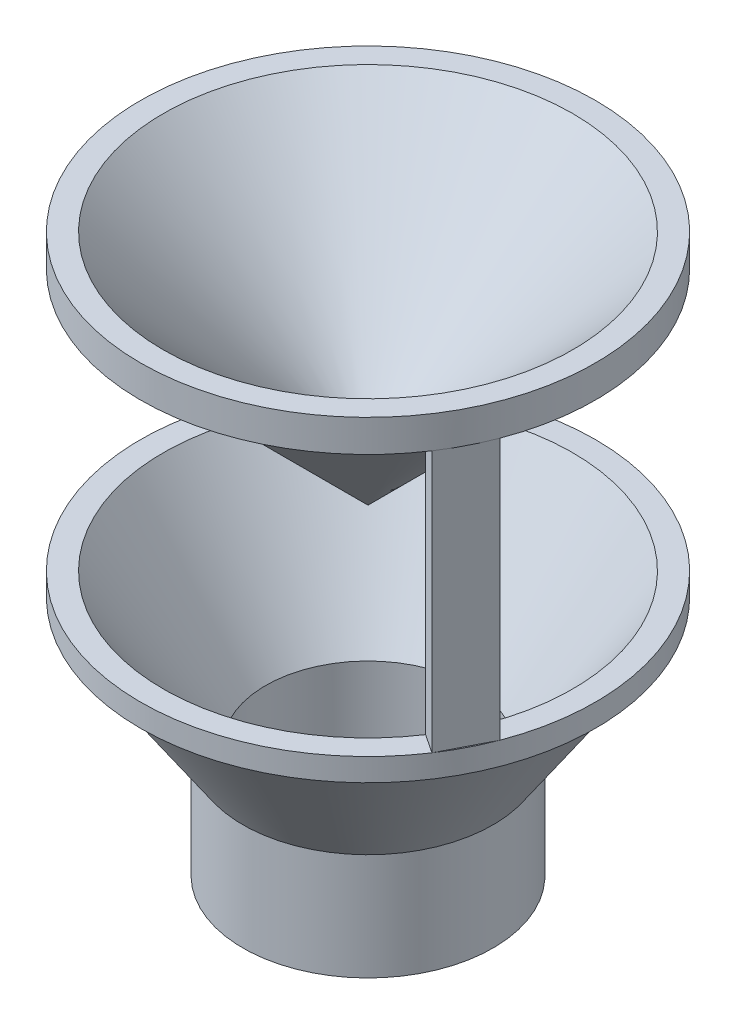
ISO-10303-21;
HEADER;
FILE_DESCRIPTION(('STEP AP214'),'2;1');
FILE_NAME('part.step','',(''),(''),'','','');
FILE_SCHEMA(('AUTOMOTIVE_DESIGN { 1 0 10303 214 1 1 1 1 }'));
ENDSEC;
DATA;
#1=APPLICATION_CONTEXT('core data for automotive mechanical design processes');
#2=APPLICATION_PROTOCOL_DEFINITION('international standard','automotive_design',2000,#1);
#3=PRODUCT_CONTEXT('',#1,'mechanical');
#4=PRODUCT('Part','Part','',(#3));
#5=PRODUCT_RELATED_PRODUCT_CATEGORY('part','',(#4));
#6=PRODUCT_DEFINITION_FORMATION('','',#4);
#7=PRODUCT_DEFINITION_CONTEXT('part definition',#1,'design');
#8=PRODUCT_DEFINITION('design','',#6,#7);
#9=PRODUCT_DEFINITION_SHAPE('','',#8);
#10=(LENGTH_UNIT() NAMED_UNIT(*) SI_UNIT(.MILLI.,.METRE.));
#11=(NAMED_UNIT(*) PLANE_ANGLE_UNIT() SI_UNIT($,.RADIAN.));
#12=(NAMED_UNIT(*) SI_UNIT($,.STERADIAN.) SOLID_ANGLE_UNIT());
#13=UNCERTAINTY_MEASURE_WITH_UNIT(LENGTH_MEASURE(1.E-05),#10,'distance_accuracy_value','');
#14=(GEOMETRIC_REPRESENTATION_CONTEXT(3) GLOBAL_UNCERTAINTY_ASSIGNED_CONTEXT((#13)) GLOBAL_UNIT_ASSIGNED_CONTEXT((#10,
#11,#12)) REPRESENTATION_CONTEXT('',''));
#15=CARTESIAN_POINT('',(0.,0.,0.));
#16=DIRECTION('',(0.,0.,1.));
#17=DIRECTION('',(1.,0.,0.));
#18=AXIS2_PLACEMENT_3D('',#15,#16,#17);
#19=CARTESIAN_POINT('',(-18.,13.2287565553229,0.));
#20=DIRECTION('',(0.,-1.,0.));
#21=DIRECTION('',(0.,0.,-1.));
#22=AXIS2_PLACEMENT_3D('',#19,#20,#21);
#23=PLANE('',#22);
#24=DIRECTION('',(0.934899032600559,0.,0.354913790719013));
#25=VECTOR('',#24,1.);
#26=CARTESIAN_POINT('',(16.8281825868101,13.228756555323,6.38844823294224));
#27=LINE('',#26,#25);
#28=CARTESIAN_POINT('',(16.8281825868101,13.228756555323,6.38844823294224));
#29=VERTEX_POINT('',#28);
#30=CARTESIAN_POINT('',(18.6979806520112,13.2287565553229,7.09827581438027));
#31=VERTEX_POINT('',#30);
#32=EDGE_CURVE('E166',#29,#31,#27,.T.);
#33=ORIENTED_EDGE('',*,*,#32,.T.);
#34=CARTESIAN_POINT('',(0.,13.2287565553229,0.));
#35=DIRECTION('',(0.,-1.,0.));
#36=DIRECTION('',(0.,0.,-1.));
#37=AXIS2_PLACEMENT_3D('',#34,#35,#36);
#38=CIRCLE('',#37,20.);
#39=CARTESIAN_POINT('',(-16.6843308410737,13.228756555323,-11.0287399273715));
#40=VERTEX_POINT('',#39);
#41=EDGE_CURVE('E381',#40,#31,#38,.T.);
#42=ORIENTED_EDGE('',*,*,#41,.F.);
#43=DIRECTION('',(0.834216542053683,0.,0.551436996368575));
#44=VECTOR('',#43,1.);
#45=CARTESIAN_POINT('',(-15.0158977569663,13.228756555323,-9.92586593463436));
#46=LINE('',#45,#44);
#47=CARTESIAN_POINT('',(-15.0158977569663,13.228756555323,-9.92586593463436));
#48=VERTEX_POINT('',#47);
#49=EDGE_CURVE('E423',#40,#48,#46,.T.);
#50=ORIENTED_EDGE('',*,*,#49,.T.);
#51=CARTESIAN_POINT('',(0.,13.228756555323,0.));
#52=DIRECTION('',(0.,-1.,0.));
#53=DIRECTION('',(0.,0.,-1.));
#54=AXIS2_PLACEMENT_3D('',#51,#52,#53);
#55=CIRCLE('',#54,18.);
#56=EDGE_CURVE('E405',#48,#29,#55,.T.);
#57=ORIENTED_EDGE('',*,*,#56,.T.);
#58=EDGE_LOOP('',(#33,#42,#50,#57));
#59=FACE_BOUND('',#58,.T.);
#60=ADVANCED_FACE('F39',(#59),#23,.F.);
#61=DIRECTION('',(-0.456440206209169,0.,0.889754088586128));
#62=VECTOR('',#61,1.);
#63=CARTESIAN_POINT('',(18.6979806520112,13.228756555323,7.09827581438027));
#64=LINE('',#63,#62);
#65=CARTESIAN_POINT('',(16.6724905238818,13.2287565553229,11.0466311485027));
#66=VERTEX_POINT('',#65);
#67=EDGE_CURVE('E171',#31,#66,#64,.T.);
#68=ORIENTED_EDGE('',*,*,#67,.T.);
#69=EDGE_CURVE('E449',#31,#66,#38,.T.);
#70=ORIENTED_EDGE('',*,*,#69,.F.);
#71=EDGE_LOOP('',(#68,#70));
#72=FACE_BOUND('',#71,.T.);
#73=ADVANCED_FACE('F294',(#72),#23,.F.);
#74=DIRECTION('',(-0.833624526194091,0.,-0.552331557425138));
#75=VECTOR('',#74,1.);
#76=CARTESIAN_POINT('',(15.0052414714936,13.228756555323,9.94196803365246));
#77=LINE('',#76,#75);
#78=CARTESIAN_POINT('',(15.0052414714934,13.228756555323,9.94196803365279));
#79=VERTEX_POINT('',#78);
#80=EDGE_CURVE('E61',#66,#79,#77,.T.);
#81=ORIENTED_EDGE('',*,*,#80,.T.);
#82=CARTESIAN_POINT('',(-16.8989833192235,13.228756555323,-6.19873880532221));
#83=VERTEX_POINT('',#82);
#84=EDGE_CURVE('E133',#79,#83,#55,.T.);
#85=ORIENTED_EDGE('',*,*,#84,.T.);
#86=DIRECTION('',(-0.938832406623525,0.,-0.344374378073456));
#87=VECTOR('',#86,1.);
#88=CARTESIAN_POINT('',(-16.8989833192235,13.228756555323,-6.19873880532221));
#89=LINE('',#88,#87);
#90=CARTESIAN_POINT('',(-18.7766481324705,13.228756555323,-6.88748756146912));
#91=VERTEX_POINT('',#90);
#92=EDGE_CURVE('E433',#83,#91,#89,.T.);
#93=ORIENTED_EDGE('',*,*,#92,.T.);
#94=EDGE_CURVE('E375',#66,#91,#38,.T.);
#95=ORIENTED_EDGE('',*,*,#94,.F.);
#96=EDGE_LOOP('',(#81,#85,#93,#95));
#97=FACE_BOUND('',#96,.T.);
#98=ADVANCED_FACE('F299',(#97),#23,.F.);
#99=CARTESIAN_POINT('',(18.,36.228756555323,0.));
#100=DIRECTION('',(0.,-1.,0.));
#101=DIRECTION('',(0.,0.,-1.));
#102=AXIS2_PLACEMENT_3D('',#99,#100,#101);
#103=PLANE('',#102);
#104=CARTESIAN_POINT('',(0.,36.228756555323,0.));
#105=DIRECTION('',(0.,-1.,0.));
#106=DIRECTION('',(0.,0.,-1.));
#107=AXIS2_PLACEMENT_3D('',#104,#105,#106);
#108=CIRCLE('',#107,20.);
#109=CARTESIAN_POINT('',(-16.6843308410737,36.228756555323,-11.0287399273715));
#110=VERTEX_POINT('',#109);
#111=CARTESIAN_POINT('',(18.6979806520112,36.228756555323,7.09827581438027));
#112=VERTEX_POINT('',#111);
#113=EDGE_CURVE('E211',#110,#112,#108,.T.);
#114=ORIENTED_EDGE('',*,*,#113,.T.);
#115=DIRECTION('',(0.934899032600559,0.,0.354913790719013));
#116=VECTOR('',#115,1.);
#117=CARTESIAN_POINT('',(16.8281825868101,36.228756555323,6.38844823294224));
#118=LINE('',#117,#116);
#119=CARTESIAN_POINT('',(16.8281825868101,36.228756555323,6.38844823294224));
#120=VERTEX_POINT('',#119);
#121=EDGE_CURVE('E181',#120,#112,#118,.T.);
#122=ORIENTED_EDGE('',*,*,#121,.F.);
#123=CARTESIAN_POINT('',(0.,36.228756555323,0.));
#124=DIRECTION('',(0.,-1.,0.));
#125=DIRECTION('',(0.,0.,-1.));
#126=AXIS2_PLACEMENT_3D('',#123,#124,#125);
#127=CIRCLE('',#126,18.);
#128=CARTESIAN_POINT('',(-15.0158977569663,36.228756555323,-9.92586593463436));
#129=VERTEX_POINT('',#128);
#130=EDGE_CURVE('E212',#129,#120,#127,.T.);
#131=ORIENTED_EDGE('',*,*,#130,.F.);
#132=DIRECTION('',(0.834216542053683,0.,0.551436996368575));
#133=VECTOR('',#132,1.);
#134=CARTESIAN_POINT('',(-15.0158977569663,36.228756555323,-9.92586593463436));
#135=LINE('',#134,#133);
#136=EDGE_CURVE('E322',#110,#129,#135,.T.);
#137=ORIENTED_EDGE('',*,*,#136,.F.);
#138=EDGE_LOOP('',(#114,#122,#131,#137));
#139=FACE_BOUND('',#138,.T.);
#140=ADVANCED_FACE('F242',(#139),#103,.T.);
#141=CARTESIAN_POINT('',(16.6724905238818,36.228756555323,11.0466311485027));
#142=VERTEX_POINT('',#141);
#143=EDGE_CURVE('E326',#112,#142,#108,.T.);
#144=ORIENTED_EDGE('',*,*,#143,.T.);
#145=DIRECTION('',(-0.456440206209169,0.,0.889754088586128));
#146=VECTOR('',#145,1.);
#147=CARTESIAN_POINT('',(18.6979806520112,36.228756555323,7.09827581438027));
#148=LINE('',#147,#146);
#149=EDGE_CURVE('E174',#112,#142,#148,.T.);
#150=ORIENTED_EDGE('',*,*,#149,.F.);
#151=EDGE_LOOP('',(#144,#150));
#152=FACE_BOUND('',#151,.T.);
#153=ADVANCED_FACE('F312',(#152),#103,.T.);
#154=CARTESIAN_POINT('',(15.0052414714936,36.228756555323,9.94196803365246));
#155=VERTEX_POINT('',#154);
#156=CARTESIAN_POINT('',(-16.8989833192233,36.228756555323,-6.19873880532257));
#157=VERTEX_POINT('',#156);
#158=EDGE_CURVE('E210',#155,#157,#127,.T.);
#159=ORIENTED_EDGE('',*,*,#158,.F.);
#160=DIRECTION('',(-0.833624526194091,0.,-0.552331557425138));
#161=VECTOR('',#160,1.);
#162=CARTESIAN_POINT('',(15.0052414714936,36.228756555323,9.94196803365246));
#163=LINE('',#162,#161);
#164=EDGE_CURVE('E167',#142,#155,#163,.T.);
#165=ORIENTED_EDGE('',*,*,#164,.F.);
#166=CARTESIAN_POINT('',(-18.7766481324705,36.228756555323,-6.88748756146912));
#167=VERTEX_POINT('',#166);
#168=EDGE_CURVE('E205',#142,#167,#108,.T.);
#169=ORIENTED_EDGE('',*,*,#168,.T.);
#170=DIRECTION('',(-0.938832406623525,0.,-0.344374378073456));
#171=VECTOR('',#170,1.);
#172=CARTESIAN_POINT('',(-16.8989833192235,36.228756555323,-6.19873880532221));
#173=LINE('',#172,#171);
#174=EDGE_CURVE('E338',#157,#167,#173,.T.);
#175=ORIENTED_EDGE('',*,*,#174,.F.);
#176=EDGE_LOOP('',(#159,#165,#169,#175));
#177=FACE_BOUND('',#176,.T.);
#178=ADVANCED_FACE('F240',(#177),#103,.T.);
#179=CARTESIAN_POINT('',(0.,18.2287565553229,0.));
#180=DIRECTION('',(0.,1.,0.));
#181=DIRECTION('',(0.,0.,1.));
#182=AXIS2_PLACEMENT_3D('',#179,#180,#181);
#183=CONICAL_SURFACE('',#182,0.,0.785398163397447);
#184=CARTESIAN_POINT('',(0.,18.2287565553229,0.));
#185=VERTEX_POINT('',#184);
#186=VERTEX_LOOP('',#185);
#187=FACE_BOUND('',#186,.T.);
#188=ORIENTED_EDGE('',*,*,#130,.T.);
#189=CARTESIAN_POINT('',(16.82827151922,36.2287687167156,6.38824823294224));
#190=CARTESIAN_POINT('',(16.6928070430401,36.2102277795282,6.69289414607938));
#191=CARTESIAN_POINT('',(16.5573425668601,36.2009573109344,6.99754005921651));
#192=CARTESIAN_POINT('',(16.2864136145002,36.2009573109344,7.60683188549077));
#193=CARTESIAN_POINT('',(16.1509491383203,36.2102277795282,7.9114777986279));
#194=CARTESIAN_POINT('',(16.0154846621404,36.2287687167156,8.21612371176504));
#195=B_SPLINE_CURVE_WITH_KNOTS('',3,(#189,#190,#191,#192,#193,#194),.UNSPECIFIED.,.F.,.F.,(4,2,
4),(0.,1.00060545899585,2.00121091799169),.UNSPECIFIED.);
#196=CARTESIAN_POINT('',(16.0155735945503,36.228756555323,8.21592371176504));
#197=VERTEX_POINT('',#196);
#198=EDGE_CURVE('E11',#120,#197,#195,.T.);
#199=ORIENTED_EDGE('',*,*,#198,.T.);
#200=CARTESIAN_POINT('',(16.0156906636325,36.2287694314635,8.21572371176504));
#201=CARTESIAN_POINT('',(15.847262953429,36.2102280177775,8.50346443207961));
#202=CARTESIAN_POINT('',(15.6788352432255,36.2009573109344,8.79120515239418));
#203=CARTESIAN_POINT('',(15.3419798228185,36.2009573109344,9.36668659302332));
#204=CARTESIAN_POINT('',(15.1735521126149,36.2102280177775,9.65442731333789));
#205=CARTESIAN_POINT('',(15.0051244024114,36.2287694314635,9.94216803365246));
#206=B_SPLINE_CURVE_WITH_KNOTS('',3,(#200,#201,#202,#203,#204,#205),.UNSPECIFIED.,.F.,.F.,(4,2,
4),(0.,1.00061833646613,2.00123667293226),.UNSPECIFIED.);
#207=EDGE_CURVE('E54',#197,#155,#206,.T.);
#208=ORIENTED_EDGE('',*,*,#207,.T.);
#209=ORIENTED_EDGE('',*,*,#158,.T.);
#210=CARTESIAN_POINT('',(-16.0242902809367,36.2287697925721,-8.19893880532221));
#211=CARTESIAN_POINT('',(-16.1700870307441,36.2066807699022,-7.86553880532221));
#212=CARTESIAN_POINT('',(-16.3158837805516,36.1956362585673,-7.53213880532221));
#213=CARTESIAN_POINT('',(-16.6074772801664,36.1956362585673,-6.86533880532221));
#214=CARTESIAN_POINT('',(-16.7532740299738,36.2066807699022,-6.53193880532221));
#215=CARTESIAN_POINT('',(-16.8990707797812,36.2287697925721,-6.19853880532221));
#216=B_SPLINE_CURVE_WITH_KNOTS('',3,(#210,#211,#212,#213,#214,#215),.UNSPECIFIED.,.F.,.F.,(4,2,
4),(0.,1.09215754420565,2.18431508841129),.UNSPECIFIED.);
#217=CARTESIAN_POINT('',(-16.0243777414943,36.228756555323,-8.19873880532256));
#218=VERTEX_POINT('',#217);
#219=EDGE_CURVE('E216',#218,#157,#216,.T.);
#220=ORIENTED_EDGE('',*,*,#219,.F.);
#221=CARTESIAN_POINT('',(-15.0157809757558,36.22876942339,-9.92606593463436));
#222=CARTESIAN_POINT('',(-15.1838999002473,36.2102280150863,-9.63814474641566));
#223=CARTESIAN_POINT('',(-15.3520188247388,36.2009573109344,-9.35022355819697));
#224=CARTESIAN_POINT('',(-15.6882566737219,36.2009573109344,-8.77438118175959));
#225=CARTESIAN_POINT('',(-15.8563755982135,36.2102280150863,-8.4864599935409));
#226=CARTESIAN_POINT('',(-16.024494522705,36.22876942339,-8.1985388053222));
#227=B_SPLINE_CURVE_WITH_KNOTS('',3,(#221,#222,#223,#224,#225,#226),.UNSPECIFIED.,.F.,.F.,(4,2,
4),(0.,1.00061819100811,2.00123638201623),.UNSPECIFIED.);
#228=EDGE_CURVE('E225',#129,#218,#227,.T.);
#229=ORIENTED_EDGE('',*,*,#228,.F.);
#230=EDGE_LOOP('',(#188,#199,#208,#209,#220,#229));
#231=FACE_BOUND('',#230,.T.);
#232=ADVANCED_FACE('F235',(#187,#231),#183,.T.);
#233=EDGE_CURVE('E376',#91,#40,#38,.T.);
#234=ORIENTED_EDGE('',*,*,#233,.F.);
#235=DIRECTION('',(0.45094969167841,0.,-0.892549368704693));
#236=VECTOR('',#235,1.);
#237=CARTESIAN_POINT('',(-16.6843308410737,13.228756555323,-11.0287399273715));
#238=LINE('',#237,#236);
#239=EDGE_CURVE('E359',#91,#40,#238,.T.);
#240=ORIENTED_EDGE('',*,*,#239,.T.);
#241=EDGE_LOOP('',(#234,#240));
#242=FACE_BOUND('',#241,.T.);
#243=ADVANCED_FACE('F41',(#242),#23,.F.);
#244=CARTESIAN_POINT('',(0.,0.,0.));
#245=DIRECTION('',(0.,1.,0.));
#246=DIRECTION('',(0.,0.,1.));
#247=AXIS2_PLACEMENT_3D('',#244,#245,#246);
#248=CONICAL_SURFACE('',#247,9.,0.59740641664535);
#249=CARTESIAN_POINT('',(-16.0243777414945,13.228756555323,-8.19873880532221));
#250=VERTEX_POINT('',#249);
#251=EDGE_CURVE('E256',#83,#250,#55,.T.);
#252=ORIENTED_EDGE('',*,*,#251,.F.);
#253=ORIENTED_EDGE('',*,*,#84,.F.);
#254=CARTESIAN_POINT('',(0.,13.228756555323,0.));
#255=DIRECTION('',(0.,-1.,0.));
#256=DIRECTION('',(0.,0.,-1.));
#257=AXIS2_PLACEMENT_3D('',#254,#255,#256);
#258=CIRCLE('',#257,18.);
#259=CARTESIAN_POINT('',(16.0155735945503,13.228756555323,8.21592371176504));
#260=VERTEX_POINT('',#259);
#261=EDGE_CURVE('E129',#79,#260,#258,.F.);
#262=ORIENTED_EDGE('',*,*,#261,.T.);
#263=EDGE_CURVE('E69',#260,#29,#258,.F.);
#264=ORIENTED_EDGE('',*,*,#263,.T.);
#265=ORIENTED_EDGE('',*,*,#56,.F.);
#266=EDGE_CURVE('E408',#250,#48,#55,.T.);
#267=ORIENTED_EDGE('',*,*,#266,.F.);
#268=EDGE_LOOP('',(#252,#253,#262,#264,#265,#267));
#269=FACE_BOUND('',#268,.T.);
#270=CARTESIAN_POINT('',(0.,0.,0.));
#271=DIRECTION('',(0.,-1.,0.));
#272=DIRECTION('',(0.,0.,-1.));
#273=AXIS2_PLACEMENT_3D('',#270,#271,#272);
#274=CIRCLE('',#273,9.);
#275=CARTESIAN_POINT('',(0.,0.,-9.));
#276=VERTEX_POINT('',#275);
#277=EDGE_CURVE('E400',#276,#276,#274,.T.);
#278=ORIENTED_EDGE('',*,*,#277,.T.);
#279=EDGE_LOOP('',(#278));
#280=FACE_BOUND('',#279,.T.);
#281=ADVANCED_FACE('F131',(#269,#280),#248,.F.);
#282=CARTESIAN_POINT('',(0.,0.,0.));
#283=DIRECTION('',(0.,-1.,0.));
#284=DIRECTION('',(0.,0.,-1.));
#285=AXIS2_PLACEMENT_3D('',#282,#283,#284);
#286=CYLINDRICAL_SURFACE('',#285,9.);
#287=ORIENTED_EDGE('',*,*,#277,.F.);
#288=EDGE_LOOP('',(#287));
#289=FACE_BOUND('',#288,.T.);
#290=CARTESIAN_POINT('',(0.,-10.,0.));
#291=DIRECTION('',(0.,-1.,0.));
#292=DIRECTION('',(0.,0.,-1.));
#293=AXIS2_PLACEMENT_3D('',#290,#291,#292);
#294=CIRCLE('',#293,9.);
#295=CARTESIAN_POINT('',(0.,-10.,-9.));
#296=VERTEX_POINT('',#295);
#297=EDGE_CURVE('E397',#296,#296,#294,.T.);
#298=ORIENTED_EDGE('',*,*,#297,.T.);
#299=EDGE_LOOP('',(#298));
#300=FACE_BOUND('',#299,.T.);
#301=ADVANCED_FACE('F306',(#289,#300),#286,.F.);
#302=CARTESIAN_POINT('',(-9.,-10.,0.));
#303=DIRECTION('',(0.,-1.,0.));
#304=DIRECTION('',(0.,0.,-1.));
#305=AXIS2_PLACEMENT_3D('',#302,#303,#304);
#306=PLANE('',#305);
#307=CARTESIAN_POINT('',(0.,-10.,0.));
#308=DIRECTION('',(0.,-1.,0.));
#309=DIRECTION('',(0.,0.,-1.));
#310=AXIS2_PLACEMENT_3D('',#307,#308,#309);
#311=CIRCLE('',#310,11.);
#312=CARTESIAN_POINT('',(0.,-10.,-11.));
#313=VERTEX_POINT('',#312);
#314=EDGE_CURVE('E393',#313,#313,#311,.T.);
#315=ORIENTED_EDGE('',*,*,#314,.T.);
#316=EDGE_LOOP('',(#315));
#317=FACE_BOUND('',#316,.T.);
#318=ORIENTED_EDGE('',*,*,#297,.F.);
#319=EDGE_LOOP('',(#318));
#320=FACE_BOUND('',#319,.T.);
#321=ADVANCED_FACE('F484',(#317,#320),#306,.T.);
#322=CARTESIAN_POINT('',(0.,0.,0.));
#323=DIRECTION('',(0.,-1.,0.));
#324=DIRECTION('',(0.,0.,-1.));
#325=AXIS2_PLACEMENT_3D('',#322,#323,#324);
#326=CYLINDRICAL_SURFACE('',#325,11.);
#327=CARTESIAN_POINT('',(0.,-0.615831876594899,0.));
#328=DIRECTION('',(0.,-1.,0.));
#329=DIRECTION('',(0.,0.,-1.));
#330=AXIS2_PLACEMENT_3D('',#327,#328,#329);
#331=CIRCLE('',#330,11.);
#332=CARTESIAN_POINT('',(0.,-0.615831876594899,-11.));
#333=VERTEX_POINT('',#332);
#334=EDGE_CURVE('E389',#333,#333,#331,.T.);
#335=ORIENTED_EDGE('',*,*,#334,.T.);
#336=EDGE_LOOP('',(#335));
#337=FACE_BOUND('',#336,.T.);
#338=ORIENTED_EDGE('',*,*,#314,.F.);
#339=EDGE_LOOP('',(#338));
#340=FACE_BOUND('',#339,.T.);
#341=ADVANCED_FACE('F480',(#337,#340),#326,.T.);
#342=CARTESIAN_POINT('',(0.,-0.615831876594899,0.));
#343=DIRECTION('',(0.,1.,0.));
#344=DIRECTION('',(0.,0.,1.));
#345=AXIS2_PLACEMENT_3D('',#342,#343,#344);
#346=CONICAL_SURFACE('',#345,11.,0.59740641664535);
#347=CARTESIAN_POINT('',(0.,11.2287565553229,0.));
#348=DIRECTION('',(0.,-1.,0.));
#349=DIRECTION('',(0.,0.,-1.));
#350=AXIS2_PLACEMENT_3D('',#347,#348,#349);
#351=CIRCLE('',#350,19.0583005244258);
#352=CARTESIAN_POINT('',(0.,11.2287565553229,-19.0583005244258));
#353=VERTEX_POINT('',#352);
#354=EDGE_CURVE('E385',#353,#353,#351,.T.);
#355=ORIENTED_EDGE('',*,*,#354,.T.);
#356=EDGE_LOOP('',(#355));
#357=FACE_BOUND('',#356,.T.);
#358=ORIENTED_EDGE('',*,*,#334,.F.);
#359=EDGE_LOOP('',(#358));
#360=FACE_BOUND('',#359,.T.);
#361=ADVANCED_FACE('F473',(#357,#360),#346,.T.);
#362=CARTESIAN_POINT('',(-18.,11.2287565553229,0.));
#363=DIRECTION('',(0.,-1.,0.));
#364=DIRECTION('',(0.,0.,-1.));
#365=AXIS2_PLACEMENT_3D('',#362,#363,#364);
#366=PLANE('',#365);
#367=CARTESIAN_POINT('',(0.,11.2287565553229,0.));
#368=DIRECTION('',(0.,-1.,0.));
#369=DIRECTION('',(0.,0.,-1.));
#370=AXIS2_PLACEMENT_3D('',#367,#368,#369);
#371=CIRCLE('',#370,20.);
#372=CARTESIAN_POINT('',(0.,11.2287565553229,-20.));
#373=VERTEX_POINT('',#372);
#374=EDGE_CURVE('E380',#373,#373,#371,.T.);
#375=ORIENTED_EDGE('',*,*,#374,.T.);
#376=EDGE_LOOP('',(#375));
#377=FACE_BOUND('',#376,.T.);
#378=ORIENTED_EDGE('',*,*,#354,.F.);
#379=EDGE_LOOP('',(#378));
#380=FACE_BOUND('',#379,.T.);
#381=ADVANCED_FACE('F468',(#377,#380),#366,.T.);
#382=CARTESIAN_POINT('',(0.,0.,0.));
#383=DIRECTION('',(0.,-1.,0.));
#384=DIRECTION('',(0.,0.,-1.));
#385=AXIS2_PLACEMENT_3D('',#382,#383,#384);
#386=CYLINDRICAL_SURFACE('',#385,20.);
#387=ORIENTED_EDGE('',*,*,#233,.T.);
#388=ORIENTED_EDGE('',*,*,#41,.T.);
#389=ORIENTED_EDGE('',*,*,#69,.T.);
#390=ORIENTED_EDGE('',*,*,#94,.T.);
#391=EDGE_LOOP('',(#387,#388,#389,#390));
#392=FACE_BOUND('',#391,.T.);
#393=ORIENTED_EDGE('',*,*,#374,.F.);
#394=EDGE_LOOP('',(#393));
#395=FACE_BOUND('',#394,.T.);
#396=ADVANCED_FACE('F445',(#392,#395),#386,.T.);
#397=CARTESIAN_POINT('',(0.,13.228756555323,0.));
#398=DIRECTION('',(0.,1.,0.));
#399=DIRECTION('',(0.,0.,1.));
#400=AXIS2_PLACEMENT_3D('',#397,#398,#399);
#401=PLANE('',#400);
#402=DIRECTION('',(-0.400667167823377,0.,0.916223673907411));
#403=VECTOR('',#402,1.);
#404=CARTESIAN_POINT('',(-16.0243777414945,13.228756555323,-8.19873880532221));
#405=LINE('',#404,#403);
#406=EDGE_CURVE('E439',#250,#83,#405,.T.);
#407=ORIENTED_EDGE('',*,*,#406,.T.);
#408=ORIENTED_EDGE('',*,*,#251,.T.);
#409=EDGE_LOOP('',(#407,#408));
#410=FACE_BOUND('',#409,.T.);
#411=ADVANCED_FACE('F244',(#410),#401,.F.);
#412=DIRECTION('',(-0.504239992264096,0.,0.863563564656073));
#413=VECTOR('',#412,1.);
#414=CARTESIAN_POINT('',(-16.0243777414945,13.228756555323,-8.19873880532221));
#415=LINE('',#414,#413);
#416=EDGE_CURVE('E419',#48,#250,#415,.T.);
#417=ORIENTED_EDGE('',*,*,#416,.T.);
#418=ORIENTED_EDGE('',*,*,#266,.T.);
#419=EDGE_LOOP('',(#417,#418));
#420=FACE_BOUND('',#419,.T.);
#421=ADVANCED_FACE('F418',(#420),#401,.F.);
#422=CARTESIAN_POINT('',(-16.0243777414945,13.228756555323,-8.19873880532221));
#423=DIRECTION('',(-0.863563564656074,0.,-0.504239992264096));
#424=DIRECTION('',(-0.504239992264096,0.,0.863563564656074));
#425=AXIS2_PLACEMENT_3D('',#422,#423,#424);
#426=PLANE('',#425);
#427=DIRECTION('',(0.,1.,0.));
#428=VECTOR('',#427,1.);
#429=CARTESIAN_POINT('',(-15.0158977569663,13.228756555323,-9.92586593463436));
#430=LINE('',#429,#428);
#431=EDGE_CURVE('E368',#48,#129,#430,.T.);
#432=ORIENTED_EDGE('',*,*,#431,.T.);
#433=ORIENTED_EDGE('',*,*,#228,.T.);
#434=DIRECTION('',(0.,1.,0.));
#435=VECTOR('',#434,1.);
#436=CARTESIAN_POINT('',(-16.0243777414945,13.228756555323,-8.19873880532221));
#437=LINE('',#436,#435);
#438=EDGE_CURVE('E366',#250,#218,#437,.T.);
#439=ORIENTED_EDGE('',*,*,#438,.F.);
#440=ORIENTED_EDGE('',*,*,#416,.F.);
#441=EDGE_LOOP('',(#432,#433,#439,#440));
#442=FACE_BOUND('',#441,.T.);
#443=ADVANCED_FACE('F461',(#442),#426,.F.);
#444=CARTESIAN_POINT('',(-16.0243777414945,13.228756555323,-8.19873880532221));
#445=DIRECTION('',(-0.916223673907411,0.,-0.400667167823377));
#446=DIRECTION('',(-0.400667167823377,0.,0.916223673907411));
#447=AXIS2_PLACEMENT_3D('',#444,#445,#446);
#448=PLANE('',#447);
#449=ORIENTED_EDGE('',*,*,#438,.T.);
#450=ORIENTED_EDGE('',*,*,#219,.T.);
#451=DIRECTION('',(0.,1.,0.));
#452=VECTOR('',#451,1.);
#453=CARTESIAN_POINT('',(-16.8989833192235,13.228756555323,-6.19873880532221));
#454=LINE('',#453,#452);
#455=EDGE_CURVE('E354',#83,#157,#454,.T.);
#456=ORIENTED_EDGE('',*,*,#455,.F.);
#457=ORIENTED_EDGE('',*,*,#406,.F.);
#458=EDGE_LOOP('',(#449,#450,#456,#457));
#459=FACE_BOUND('',#458,.T.);
#460=ADVANCED_FACE('F232',(#459),#448,.F.);
#461=CARTESIAN_POINT('',(-16.8989833192235,13.228756555323,-6.19873880532221));
#462=DIRECTION('',(0.344374378073456,0.,-0.938832406623525));
#463=DIRECTION('',(-0.938832406623525,0.,-0.344374378073456));
#464=AXIS2_PLACEMENT_3D('',#461,#462,#463);
#465=PLANE('',#464);
#466=ORIENTED_EDGE('',*,*,#174,.T.);
#467=DIRECTION('',(0.,1.,0.));
#468=VECTOR('',#467,1.);
#469=CARTESIAN_POINT('',(-18.7766481324705,13.228756555323,-6.88748756146912));
#470=LINE('',#469,#468);
#471=EDGE_CURVE('E351',#91,#167,#470,.T.);
#472=ORIENTED_EDGE('',*,*,#471,.F.);
#473=ORIENTED_EDGE('',*,*,#92,.F.);
#474=ORIENTED_EDGE('',*,*,#455,.T.);
#475=EDGE_LOOP('',(#466,#472,#473,#474));
#476=FACE_BOUND('',#475,.T.);
#477=ADVANCED_FACE('F349',(#476),#465,.F.);
#478=CARTESIAN_POINT('',(-16.6843308410737,13.228756555323,-11.0287399273715));
#479=DIRECTION('',(0.892549368704693,0.,0.45094969167841));
#480=DIRECTION('',(0.45094969167841,0.,-0.892549368704693));
#481=AXIS2_PLACEMENT_3D('',#478,#479,#480);
#482=PLANE('',#481);
#483=DIRECTION('',(0.45094969167841,0.,-0.892549368704693));
#484=VECTOR('',#483,1.);
#485=CARTESIAN_POINT('',(-16.6843308410737,36.228756555323,-11.0287399273715));
#486=LINE('',#485,#484);
#487=EDGE_CURVE('E340',#167,#110,#486,.T.);
#488=ORIENTED_EDGE('',*,*,#487,.T.);
#489=DIRECTION('',(0.,1.,0.));
#490=VECTOR('',#489,1.);
#491=CARTESIAN_POINT('',(-16.6843308410737,13.228756555323,-11.0287399273715));
#492=LINE('',#491,#490);
#493=EDGE_CURVE('E362',#40,#110,#492,.T.);
#494=ORIENTED_EDGE('',*,*,#493,.F.);
#495=ORIENTED_EDGE('',*,*,#239,.F.);
#496=ORIENTED_EDGE('',*,*,#471,.T.);
#497=EDGE_LOOP('',(#488,#494,#495,#496));
#498=FACE_BOUND('',#497,.T.);
#499=ADVANCED_FACE('F357',(#498),#482,.F.);
#500=CARTESIAN_POINT('',(-15.0158977569663,13.228756555323,-9.92586593463436));
#501=DIRECTION('',(-0.551436996368575,0.,0.834216542053683));
#502=DIRECTION('',(0.834216542053683,0.,0.551436996368575));
#503=AXIS2_PLACEMENT_3D('',#500,#501,#502);
#504=PLANE('',#503);
#505=ORIENTED_EDGE('',*,*,#136,.T.);
#506=ORIENTED_EDGE('',*,*,#431,.F.);
#507=ORIENTED_EDGE('',*,*,#49,.F.);
#508=ORIENTED_EDGE('',*,*,#493,.T.);
#509=EDGE_LOOP('',(#505,#506,#507,#508));
#510=FACE_BOUND('',#509,.T.);
#511=ADVANCED_FACE('F290',(#510),#504,.F.);
#512=ORIENTED_EDGE('',*,*,#487,.F.);
#513=EDGE_CURVE('E206',#167,#110,#108,.T.);
#514=ORIENTED_EDGE('',*,*,#513,.T.);
#515=EDGE_LOOP('',(#512,#514));
#516=FACE_BOUND('',#515,.T.);
#517=ADVANCED_FACE('F285',(#516),#103,.T.);
#518=CARTESIAN_POINT('',(0.,0.,0.));
#519=DIRECTION('',(0.,-1.,0.));
#520=DIRECTION('',(0.,0.,-1.));
#521=AXIS2_PLACEMENT_3D('',#518,#519,#520);
#522=CYLINDRICAL_SURFACE('',#521,20.);
#523=CARTESIAN_POINT('',(0.,39.0571836800691,0.));
#524=DIRECTION('',(0.,-1.,0.));
#525=DIRECTION('',(0.,0.,-1.));
#526=AXIS2_PLACEMENT_3D('',#523,#524,#525);
#527=CIRCLE('',#526,20.);
#528=CARTESIAN_POINT('',(0.,39.0571836800691,-20.));
#529=VERTEX_POINT('',#528);
#530=EDGE_CURVE('E201',#529,#529,#527,.T.);
#531=ORIENTED_EDGE('',*,*,#530,.T.);
#532=EDGE_LOOP('',(#531));
#533=FACE_BOUND('',#532,.T.);
#534=ORIENTED_EDGE('',*,*,#513,.F.);
#535=ORIENTED_EDGE('',*,*,#168,.F.);
#536=ORIENTED_EDGE('',*,*,#143,.F.);
#537=ORIENTED_EDGE('',*,*,#113,.F.);
#538=EDGE_LOOP('',(#534,#535,#536,#537));
#539=FACE_BOUND('',#538,.T.);
#540=ADVANCED_FACE('F282',(#533,#539),#522,.T.);
#541=CARTESIAN_POINT('',(20.,39.0571836800691,0.));
#542=DIRECTION('',(0.,1.,0.));
#543=DIRECTION('',(0.,0.,1.));
#544=AXIS2_PLACEMENT_3D('',#541,#542,#543);
#545=PLANE('',#544);
#546=CARTESIAN_POINT('',(0.,39.0571836800691,0.));
#547=DIRECTION('',(0.,-1.,0.));
#548=DIRECTION('',(0.,0.,-1.));
#549=AXIS2_PLACEMENT_3D('',#546,#547,#548);
#550=CIRCLE('',#549,18.);
#551=CARTESIAN_POINT('',(0.,39.0571836800691,-18.));
#552=VERTEX_POINT('',#551);
#553=EDGE_CURVE('E138',#552,#552,#550,.T.);
#554=ORIENTED_EDGE('',*,*,#553,.T.);
#555=EDGE_LOOP('',(#554));
#556=FACE_BOUND('',#555,.T.);
#557=ORIENTED_EDGE('',*,*,#530,.F.);
#558=EDGE_LOOP('',(#557));
#559=FACE_BOUND('',#558,.T.);
#560=ADVANCED_FACE('F279',(#556,#559),#545,.T.);
#561=CARTESIAN_POINT('',(0.,39.0571836800691,0.));
#562=DIRECTION('',(0.,1.,0.));
#563=DIRECTION('',(0.,0.,1.));
#564=AXIS2_PLACEMENT_3D('',#561,#562,#563);
#565=CONICAL_SURFACE('',#564,18.,0.785398163397448);
#566=CARTESIAN_POINT('',(0.,21.0571836800691,0.));
#567=VERTEX_POINT('',#566);
#568=VERTEX_LOOP('',#567);
#569=FACE_BOUND('',#568,.T.);
#570=ORIENTED_EDGE('',*,*,#553,.F.);
#571=EDGE_LOOP('',(#570));
#572=FACE_BOUND('',#571,.T.);
#573=ADVANCED_FACE('F276',(#569,#572),#565,.F.);
#574=CARTESIAN_POINT('',(0.,13.228756555323,0.));
#575=DIRECTION('',(0.,-1.,0.));
#576=DIRECTION('',(0.,0.,-1.));
#577=AXIS2_PLACEMENT_3D('',#574,#575,#576);
#578=PLANE('',#577);
#579=ORIENTED_EDGE('',*,*,#261,.F.);
#580=DIRECTION('',(0.505166061528334,0.,-0.86302216094371));
#581=VECTOR('',#580,1.);
#582=CARTESIAN_POINT('',(16.0155735945503,13.228756555323,8.21592371176504));
#583=LINE('',#582,#581);
#584=EDGE_CURVE('E149',#79,#260,#583,.T.);
#585=ORIENTED_EDGE('',*,*,#584,.T.);
#586=EDGE_LOOP('',(#579,#585));
#587=FACE_BOUND('',#586,.T.);
#588=ADVANCED_FACE('F151',(#587),#578,.T.);
#589=ORIENTED_EDGE('',*,*,#263,.F.);
#590=DIRECTION('',(0.406304496129873,0.,-0.913737739411397));
#591=VECTOR('',#590,1.);
#592=CARTESIAN_POINT('',(16.0155735945503,13.228756555323,8.21592371176504));
#593=LINE('',#592,#591);
#594=EDGE_CURVE('E144',#260,#29,#593,.T.);
#595=ORIENTED_EDGE('',*,*,#594,.T.);
#596=EDGE_LOOP('',(#589,#595));
#597=FACE_BOUND('',#596,.T.);
#598=ADVANCED_FACE('F142',(#597),#578,.T.);
#599=CARTESIAN_POINT('',(16.0155735945503,13.228756555323,8.21592371176504));
#600=DIRECTION('',(0.913737739411397,0.,0.406304496129873));
#601=DIRECTION('',(0.406304496129873,0.,-0.913737739411397));
#602=AXIS2_PLACEMENT_3D('',#599,#600,#601);
#603=PLANE('',#602);
#604=ORIENTED_EDGE('',*,*,#198,.F.);
#605=DIRECTION('',(0.,1.,0.));
#606=VECTOR('',#605,1.);
#607=CARTESIAN_POINT('',(16.8281825868101,13.228756555323,6.38844823294224));
#608=LINE('',#607,#606);
#609=EDGE_CURVE('E147',#29,#120,#608,.T.);
#610=ORIENTED_EDGE('',*,*,#609,.F.);
#611=ORIENTED_EDGE('',*,*,#594,.F.);
#612=DIRECTION('',(0.,1.,0.));
#613=VECTOR('',#612,1.);
#614=CARTESIAN_POINT('',(16.0155735945503,13.228756555323,8.21592371176504));
#615=LINE('',#614,#613);
#616=EDGE_CURVE('E154',#260,#197,#615,.T.);
#617=ORIENTED_EDGE('',*,*,#616,.T.);
#618=EDGE_LOOP('',(#604,#610,#611,#617));
#619=FACE_BOUND('',#618,.T.);
#620=ADVANCED_FACE('F163',(#619),#603,.F.);
#621=CARTESIAN_POINT('',(16.8281825868101,13.228756555323,6.38844823294224));
#622=DIRECTION('',(-0.354913790719013,0.,0.934899032600559));
#623=DIRECTION('',(0.934899032600559,0.,0.354913790719013));
#624=AXIS2_PLACEMENT_3D('',#621,#622,#623);
#625=PLANE('',#624);
#626=ORIENTED_EDGE('',*,*,#121,.T.);
#627=DIRECTION('',(0.,1.,0.));
#628=VECTOR('',#627,1.);
#629=CARTESIAN_POINT('',(18.6979806520112,13.228756555323,7.09827581438027));
#630=LINE('',#629,#628);
#631=EDGE_CURVE('E192',#31,#112,#630,.T.);
#632=ORIENTED_EDGE('',*,*,#631,.F.);
#633=ORIENTED_EDGE('',*,*,#32,.F.);
#634=ORIENTED_EDGE('',*,*,#609,.T.);
#635=EDGE_LOOP('',(#626,#632,#633,#634));
#636=FACE_BOUND('',#635,.T.);
#637=ADVANCED_FACE('F269',(#636),#625,.F.);
#638=CARTESIAN_POINT('',(18.6979806520112,13.228756555323,7.09827581438027));
#639=DIRECTION('',(-0.889754088586128,0.,-0.456440206209169));
#640=DIRECTION('',(-0.456440206209169,0.,0.889754088586128));
#641=AXIS2_PLACEMENT_3D('',#638,#639,#640);
#642=PLANE('',#641);
#643=ORIENTED_EDGE('',*,*,#149,.T.);
#644=DIRECTION('',(0.,1.,0.));
#645=VECTOR('',#644,1.);
#646=CARTESIAN_POINT('',(16.6724905238818,13.228756555323,11.0466311485027));
#647=LINE('',#646,#645);
#648=EDGE_CURVE('E188',#66,#142,#647,.T.);
#649=ORIENTED_EDGE('',*,*,#648,.F.);
#650=ORIENTED_EDGE('',*,*,#67,.F.);
#651=ORIENTED_EDGE('',*,*,#631,.T.);
#652=EDGE_LOOP('',(#643,#649,#650,#651));
#653=FACE_BOUND('',#652,.T.);
#654=ADVANCED_FACE('F265',(#653),#642,.F.);
#655=CARTESIAN_POINT('',(15.0052414714936,13.228756555323,9.94196803365246));
#656=DIRECTION('',(0.552331557425138,0.,-0.833624526194091));
#657=DIRECTION('',(-0.833624526194091,0.,-0.552331557425138));
#658=AXIS2_PLACEMENT_3D('',#655,#656,#657);
#659=PLANE('',#658);
#660=ORIENTED_EDGE('',*,*,#164,.T.);
#661=DIRECTION('',(0.,1.,0.));
#662=VECTOR('',#661,1.);
#663=CARTESIAN_POINT('',(15.0052414714936,13.228756555323,9.94196803365246));
#664=LINE('',#663,#662);
#665=EDGE_CURVE('E161',#79,#155,#664,.T.);
#666=ORIENTED_EDGE('',*,*,#665,.F.);
#667=ORIENTED_EDGE('',*,*,#80,.F.);
#668=ORIENTED_EDGE('',*,*,#648,.T.);
#669=EDGE_LOOP('',(#660,#666,#667,#668));
#670=FACE_BOUND('',#669,.T.);
#671=ADVANCED_FACE('F262',(#670),#659,.F.);
#672=CARTESIAN_POINT('',(16.0155735945503,13.228756555323,8.21592371176504));
#673=DIRECTION('',(0.86302216094371,0.,0.505166061528334));
#674=DIRECTION('',(0.505166061528334,0.,-0.863022160943711));
#675=AXIS2_PLACEMENT_3D('',#672,#673,#674);
#676=PLANE('',#675);
#677=ORIENTED_EDGE('',*,*,#207,.F.);
#678=ORIENTED_EDGE('',*,*,#616,.F.);
#679=ORIENTED_EDGE('',*,*,#584,.F.);
#680=ORIENTED_EDGE('',*,*,#665,.T.);
#681=EDGE_LOOP('',(#677,#678,#679,#680));
#682=FACE_BOUND('',#681,.T.);
#683=ADVANCED_FACE('F157',(#682),#676,.F.);
#684=CLOSED_SHELL('',(#60,#73,#98,#140,#153,#178,#232,#243,#281,#301,#321,#341,#361,#381,#396,
#411,#421,#443,#460,#477,#499,#511,#517,#540,#560,#573,#588,#598,#620,#637,#654,#671,#683));
#685=MANIFOLD_SOLID_BREP('B2',#684);
#686=ADVANCED_BREP_SHAPE_REPRESENTATION('',(#18,#685),#14);
#687=SHAPE_DEFINITION_REPRESENTATION(#9,#686);
ENDSEC;
END-ISO-10303-21;
